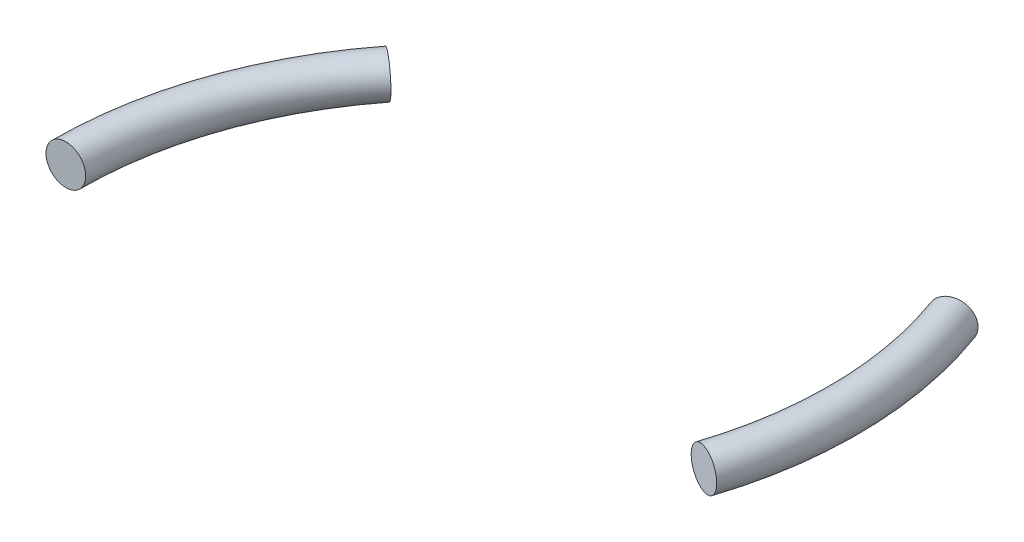
ISO-10303-21;
HEADER;
FILE_DESCRIPTION(('STEP AP214'),'2;1');
FILE_NAME('part.step','',(''),(''),'','','');
FILE_SCHEMA(('AUTOMOTIVE_DESIGN { 1 0 10303 214 1 1 1 1 }'));
ENDSEC;
DATA;
#1=APPLICATION_CONTEXT('core data for automotive mechanical design processes');
#2=APPLICATION_PROTOCOL_DEFINITION('international standard','automotive_design',2000,#1);
#3=PRODUCT_CONTEXT('',#1,'mechanical');
#4=PRODUCT('Part','Part','',(#3));
#5=PRODUCT_RELATED_PRODUCT_CATEGORY('part','',(#4));
#6=PRODUCT_DEFINITION_FORMATION('','',#4);
#7=PRODUCT_DEFINITION_CONTEXT('part definition',#1,'design');
#8=PRODUCT_DEFINITION('design','',#6,#7);
#9=PRODUCT_DEFINITION_SHAPE('','',#8);
#10=(LENGTH_UNIT() NAMED_UNIT(*) SI_UNIT(.MILLI.,.METRE.));
#11=(NAMED_UNIT(*) PLANE_ANGLE_UNIT() SI_UNIT($,.RADIAN.));
#12=(NAMED_UNIT(*) SI_UNIT($,.STERADIAN.) SOLID_ANGLE_UNIT());
#13=UNCERTAINTY_MEASURE_WITH_UNIT(LENGTH_MEASURE(1.E-05),#10,'distance_accuracy_value','');
#14=(GEOMETRIC_REPRESENTATION_CONTEXT(3) GLOBAL_UNCERTAINTY_ASSIGNED_CONTEXT((#13)) GLOBAL_UNIT_ASSIGNED_CONTEXT((#10,
#11,#12)) REPRESENTATION_CONTEXT('',''));
#15=CARTESIAN_POINT('',(0.,0.,0.));
#16=DIRECTION('',(0.,0.,1.));
#17=DIRECTION('',(1.,0.,0.));
#18=AXIS2_PLACEMENT_3D('',#15,#16,#17);
#19=CARTESIAN_POINT('',(0.,5.,0.));
#20=DIRECTION('',(0.,0.,1.));
#21=DIRECTION('',(1.,0.,0.));
#22=AXIS2_PLACEMENT_3D('',#19,#20,#21);
#23=PLANE('',#22);
#24=CARTESIAN_POINT('',(-7.825,0.7302,0.));
#25=DIRECTION('',(0.,0.,-1.));
#26=DIRECTION('',(1.,0.,0.));
#27=AXIS2_PLACEMENT_3D('',#24,#25,#26);
#28=CIRCLE('',#27,0.4);
#29=CARTESIAN_POINT('',(-8.225,0.7302,0.));
#30=VERTEX_POINT('',#29);
#31=EDGE_CURVE('P0_E18',#30,#30,#28,.T.);
#32=ORIENTED_EDGE('',*,*,#31,.F.);
#33=EDGE_LOOP('',(#32));
#34=FACE_BOUND('',#33,.T.);
#35=ADVANCED_FACE('P0_F15',(#34),#23,.T.);
#36=CARTESIAN_POINT('',(0.,5.,0.));
#37=DIRECTION('',(-0.615661475325659,0.,0.788010753606721));
#38=DIRECTION('',(0.788010753606721,0.,0.615661475325659));
#39=AXIS2_PLACEMENT_3D('',#36,#37,#38);
#40=PLANE('',#39);
#41=CARTESIAN_POINT('',(-6.16618414697259,0.7302,-4.81755104442328));
#42=DIRECTION('',(0.615661475325659,0.,-0.788010753606721));
#43=DIRECTION('',(0.788010753606721,0.,0.61566147532566));
#44=AXIS2_PLACEMENT_3D('',#41,#42,#43);
#45=CIRCLE('',#44,0.4);
#46=CARTESIAN_POINT('',(-6.48138844841528,0.7302,-5.06381563455355));
#47=VERTEX_POINT('',#46);
#48=EDGE_CURVE('P0_E10',#47,#47,#45,.T.);
#49=ORIENTED_EDGE('',*,*,#48,.T.);
#50=EDGE_LOOP('',(#49));
#51=FACE_BOUND('',#50,.T.);
#52=ADVANCED_FACE('P0_F36',(#51),#40,.F.);
#53=CARTESIAN_POINT('',(0.,0.7302,0.));
#54=DIRECTION('',(0.,-1.,0.));
#55=DIRECTION('',(0.,0.,1.));
#56=AXIS2_PLACEMENT_3D('',#53,#54,#55);
#57=TOROIDAL_SURFACE('',#56,7.825,0.4);
#58=CARTESIAN_POINT('',(0.,0.7302,0.));
#59=DIRECTION('',(0.,-1.,0.));
#60=DIRECTION('',(0.,0.,1.));
#61=AXIS2_PLACEMENT_3D('',#58,#59,#60);
#62=CIRCLE('',#61,8.225);
#63=EDGE_CURVE('',#30,#47,#62,.T.);
#64=ORIENTED_EDGE('',*,*,#31,.T.);
#65=ORIENTED_EDGE('',*,*,#48,.F.);
#66=ORIENTED_EDGE('',*,*,#63,.T.);
#67=ORIENTED_EDGE('',*,*,#63,.F.);
#68=EDGE_LOOP('',(#64,#66,#65,#67));
#69=FACE_BOUND('',#68,.T.);
#70=ADVANCED_FACE('P0_F33',(#69),#57,.T.);
#71=CLOSED_SHELL('',(#35,#52,#70));
#72=MANIFOLD_SOLID_BREP('P0_B1',#71);
#73=CARTESIAN_POINT('',(0.,0.,0.));
#74=DIRECTION('',(-0.342020143325676,0.,-0.939692620785906));
#75=DIRECTION('',(-0.939692620785906,0.,0.342020143325676));
#76=AXIS2_PLACEMENT_3D('',#73,#74,#75);
#77=PLANE('',#76);
#78=CARTESIAN_POINT('',(7.35309475764971,4.2698,-2.67630762152341));
#79=DIRECTION('',(-0.342020143325676,0.,-0.939692620785906));
#80=DIRECTION('',(-0.939692620785906,0.,0.342020143325676));
#81=AXIS2_PLACEMENT_3D('',#78,#79,#80);
#82=CIRCLE('',#81,0.4);
#83=CARTESIAN_POINT('',(7.72897180596407,4.2698,-2.81311567885369));
#84=VERTEX_POINT('',#83);
#85=EDGE_CURVE('P1_E10',#84,#84,#82,.T.);
#86=ORIENTED_EDGE('',*,*,#85,.T.);
#87=EDGE_LOOP('',(#86));
#88=FACE_BOUND('',#87,.T.);
#89=ADVANCED_FACE('P1_F15',(#88),#77,.T.);
#90=CARTESIAN_POINT('',(0.,0.,0.));
#91=DIRECTION('',(0.309016994374942,0.,-0.951056516295155));
#92=DIRECTION('',(-0.951056516295155,0.,-0.309016994374942));
#93=AXIS2_PLACEMENT_3D('',#90,#91,#92);
#94=PLANE('',#93);
#95=CARTESIAN_POINT('',(7.44201724000959,4.2698,2.41805798098392));
#96=DIRECTION('',(0.309016994374942,0.,-0.951056516295155));
#97=DIRECTION('',(-0.951056516295156,0.,-0.309016994374942));
#98=AXIS2_PLACEMENT_3D('',#95,#96,#97);
#99=CIRCLE('',#98,0.4);
#100=CARTESIAN_POINT('',(7.82243984652765,4.2698,2.5416647787339));
#101=VERTEX_POINT('',#100);
#102=EDGE_CURVE('P1_E22',#101,#101,#99,.T.);
#103=ORIENTED_EDGE('',*,*,#102,.F.);
#104=EDGE_LOOP('',(#103));
#105=FACE_BOUND('',#104,.T.);
#106=ADVANCED_FACE('P1_F35',(#105),#94,.F.);
#107=CARTESIAN_POINT('',(0.,4.2698,0.));
#108=DIRECTION('',(0.,1.,0.));
#109=DIRECTION('',(-0.342020143325676,0.,-0.939692620785906));
#110=AXIS2_PLACEMENT_3D('',#107,#108,#109);
#111=TOROIDAL_SURFACE('',#110,7.825,0.4);
#112=CARTESIAN_POINT('',(0.,4.2698,0.));
#113=DIRECTION('',(0.,1.,0.));
#114=DIRECTION('',(-0.342020143325676,0.,-0.939692620785906));
#115=AXIS2_PLACEMENT_3D('',#112,#113,#114);
#116=CIRCLE('',#115,8.225);
#117=EDGE_CURVE('',#101,#84,#116,.T.);
#118=ORIENTED_EDGE('',*,*,#102,.T.);
#119=ORIENTED_EDGE('',*,*,#85,.F.);
#120=ORIENTED_EDGE('',*,*,#117,.T.);
#121=ORIENTED_EDGE('',*,*,#117,.F.);
#122=EDGE_LOOP('',(#118,#120,#119,#121));
#123=FACE_BOUND('',#122,.T.);
#124=ADVANCED_FACE('P1_F33',(#123),#111,.T.);
#125=CLOSED_SHELL('',(#89,#106,#124));
#126=MANIFOLD_SOLID_BREP('P1_B1',#125);
#127=ADVANCED_BREP_SHAPE_REPRESENTATION('',(#18,#72,#126),#14);
#128=SHAPE_DEFINITION_REPRESENTATION(#9,#127);
ENDSEC;
END-ISO-10303-21;
